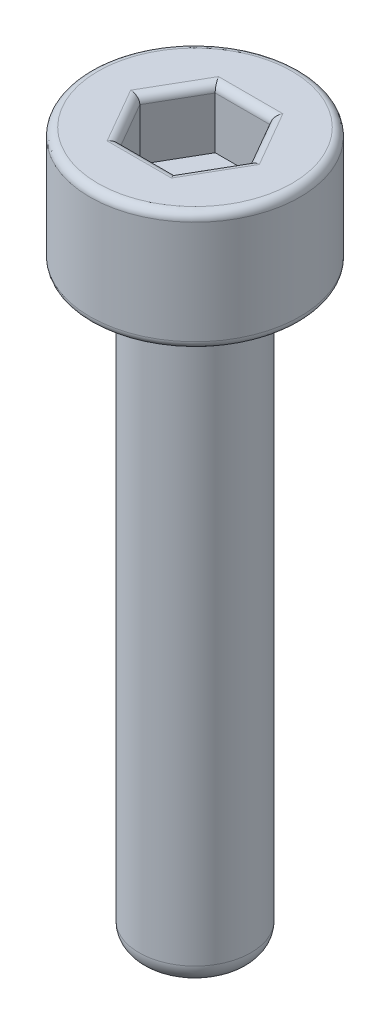
ISO-10303-21;
HEADER;
FILE_DESCRIPTION(('STEP AP214'),'2;1');
FILE_NAME('part.step','',(''),(''),'','','');
FILE_SCHEMA(('AUTOMOTIVE_DESIGN { 1 0 10303 214 1 1 1 1 }'));
ENDSEC;
DATA;
#1=APPLICATION_CONTEXT('core data for automotive mechanical design processes');
#2=APPLICATION_PROTOCOL_DEFINITION('international standard','automotive_design',2000,#1);
#3=PRODUCT_CONTEXT('',#1,'mechanical');
#4=PRODUCT('Part','Part','',(#3));
#5=PRODUCT_RELATED_PRODUCT_CATEGORY('part','',(#4));
#6=PRODUCT_DEFINITION_FORMATION('','',#4);
#7=PRODUCT_DEFINITION_CONTEXT('part definition',#1,'design');
#8=PRODUCT_DEFINITION('design','',#6,#7);
#9=PRODUCT_DEFINITION_SHAPE('','',#8);
#10=(LENGTH_UNIT() NAMED_UNIT(*) SI_UNIT(.MILLI.,.METRE.));
#11=(NAMED_UNIT(*) PLANE_ANGLE_UNIT() SI_UNIT($,.RADIAN.));
#12=(NAMED_UNIT(*) SI_UNIT($,.STERADIAN.) SOLID_ANGLE_UNIT());
#13=UNCERTAINTY_MEASURE_WITH_UNIT(LENGTH_MEASURE(1.E-05),#10,'distance_accuracy_value','');
#14=(GEOMETRIC_REPRESENTATION_CONTEXT(3) GLOBAL_UNCERTAINTY_ASSIGNED_CONTEXT((#13)) GLOBAL_UNIT_ASSIGNED_CONTEXT((#10,
#11,#12)) REPRESENTATION_CONTEXT('',''));
#15=CARTESIAN_POINT('',(0.,0.,0.));
#16=DIRECTION('',(0.,0.,1.));
#17=DIRECTION('',(1.,0.,0.));
#18=AXIS2_PLACEMENT_3D('',#15,#16,#17);
#19=CARTESIAN_POINT('',(0.,3.,0.));
#20=DIRECTION('',(0.,-1.,0.));
#21=DIRECTION('',(0.,0.,-1.));
#22=AXIS2_PLACEMENT_3D('',#19,#20,#21);
#23=CYLINDRICAL_SURFACE('',#22,2.64);
#24=CARTESIAN_POINT('',(0.,2.8,0.));
#25=DIRECTION('',(0.,1.,0.));
#26=DIRECTION('',(0.,0.,1.));
#27=AXIS2_PLACEMENT_3D('',#24,#25,#26);
#28=CIRCLE('',#27,2.64);
#29=CARTESIAN_POINT('',(0.,2.8,2.64));
#30=VERTEX_POINT('',#29);
#31=EDGE_CURVE('E186',#30,#30,#28,.F.);
#32=ORIENTED_EDGE('',*,*,#31,.T.);
#33=EDGE_LOOP('',(#32));
#34=FACE_BOUND('',#33,.T.);
#35=CARTESIAN_POINT('',(0.,0.2,0.));
#36=DIRECTION('',(0.,1.,0.));
#37=DIRECTION('',(0.,0.,1.));
#38=AXIS2_PLACEMENT_3D('',#35,#36,#37);
#39=CIRCLE('',#38,2.64);
#40=CARTESIAN_POINT('',(0.,0.2,2.64));
#41=VERTEX_POINT('',#40);
#42=EDGE_CURVE('E182',#41,#41,#39,.T.);
#43=ORIENTED_EDGE('',*,*,#42,.T.);
#44=EDGE_LOOP('',(#43));
#45=FACE_BOUND('',#44,.T.);
#46=ADVANCED_FACE('F39',(#34,#45),#23,.T.);
#47=CARTESIAN_POINT('',(0.,3.,0.));
#48=DIRECTION('',(0.,1.,0.));
#49=DIRECTION('',(0.,0.,1.));
#50=AXIS2_PLACEMENT_3D('',#47,#48,#49);
#51=PLANE('',#50);
#52=DIRECTION('',(-1.,0.,0.));
#53=VECTOR('',#52,1.);
#54=CARTESIAN_POINT('',(0.692820323027551,3.,-1.4));
#55=LINE('',#54,#53);
#56=CARTESIAN_POINT('',(-0.808290376865475,3.,-1.4));
#57=VERTEX_POINT('',#56);
#58=CARTESIAN_POINT('',(0.808290376865476,3.,-1.4));
#59=VERTEX_POINT('',#58);
#60=EDGE_CURVE('E209',#57,#59,#55,.F.);
#61=ORIENTED_EDGE('',*,*,#60,.T.);
#62=DIRECTION('',(-0.5,0.,-0.866025403784439));
#63=VECTOR('',#62,1.);
#64=CARTESIAN_POINT('',(1.55884572681199,3.,-0.0999999999999999));
#65=LINE('',#64,#63);
#66=CARTESIAN_POINT('',(1.61658075373095,3.,0.));
#67=VERTEX_POINT('',#66);
#68=EDGE_CURVE('E212',#59,#67,#65,.F.);
#69=ORIENTED_EDGE('',*,*,#68,.T.);
#70=DIRECTION('',(0.5,0.,-0.866025403784439));
#71=VECTOR('',#70,1.);
#72=CARTESIAN_POINT('',(0.866025403784438,3.,1.3));
#73=LINE('',#72,#71);
#74=CARTESIAN_POINT('',(0.808290376865476,3.,1.4));
#75=VERTEX_POINT('',#74);
#76=EDGE_CURVE('E197',#67,#75,#73,.F.);
#77=ORIENTED_EDGE('',*,*,#76,.T.);
#78=DIRECTION('',(1.,0.,0.));
#79=VECTOR('',#78,1.);
#80=CARTESIAN_POINT('',(-0.692820323027551,3.,1.4));
#81=LINE('',#80,#79);
#82=CARTESIAN_POINT('',(-0.808290376865476,3.,1.4));
#83=VERTEX_POINT('',#82);
#84=EDGE_CURVE('E200',#75,#83,#81,.F.);
#85=ORIENTED_EDGE('',*,*,#84,.T.);
#86=DIRECTION('',(0.5,0.,0.866025403784439));
#87=VECTOR('',#86,1.);
#88=CARTESIAN_POINT('',(-1.55884572681199,3.,0.1));
#89=LINE('',#88,#87);
#90=CARTESIAN_POINT('',(-1.61658075373095,3.,0.));
#91=VERTEX_POINT('',#90);
#92=EDGE_CURVE('E203',#83,#91,#89,.F.);
#93=ORIENTED_EDGE('',*,*,#92,.T.);
#94=DIRECTION('',(-0.5,0.,0.866025403784439));
#95=VECTOR('',#94,1.);
#96=CARTESIAN_POINT('',(-0.866025403784438,3.,-1.3));
#97=LINE('',#96,#95);
#98=EDGE_CURVE('E206',#91,#57,#97,.F.);
#99=ORIENTED_EDGE('',*,*,#98,.T.);
#100=EDGE_LOOP('',(#61,#69,#77,#85,#93,#99));
#101=FACE_BOUND('',#100,.T.);
#102=CARTESIAN_POINT('',(0.,3.,0.));
#103=DIRECTION('',(0.,1.,0.));
#104=DIRECTION('',(0.,0.,1.));
#105=AXIS2_PLACEMENT_3D('',#102,#103,#104);
#106=CIRCLE('',#105,2.44);
#107=CARTESIAN_POINT('',(0.,3.,2.44));
#108=VERTEX_POINT('',#107);
#109=EDGE_CURVE('E178',#108,#108,#106,.T.);
#110=ORIENTED_EDGE('',*,*,#109,.T.);
#111=EDGE_LOOP('',(#110));
#112=FACE_BOUND('',#111,.T.);
#113=ADVANCED_FACE('F261',(#101,#112),#51,.T.);
#114=CARTESIAN_POINT('',(0.,0.,0.));
#115=DIRECTION('',(0.,1.,0.));
#116=DIRECTION('',(0.,0.,1.));
#117=AXIS2_PLACEMENT_3D('',#114,#115,#116);
#118=PLANE('',#117);
#119=CARTESIAN_POINT('',(0.,0.,0.));
#120=DIRECTION('',(0.,1.,0.));
#121=DIRECTION('',(0.,0.,1.));
#122=AXIS2_PLACEMENT_3D('',#119,#120,#121);
#123=CIRCLE('',#122,2.44);
#124=CARTESIAN_POINT('',(0.,0.,2.44));
#125=VERTEX_POINT('',#124);
#126=EDGE_CURVE('E190',#125,#125,#123,.F.);
#127=ORIENTED_EDGE('',*,*,#126,.T.);
#128=EDGE_LOOP('',(#127));
#129=FACE_BOUND('',#128,.T.);
#130=CARTESIAN_POINT('',(0.,0.,0.));
#131=DIRECTION('',(0.,-1.,0.));
#132=DIRECTION('',(0.,0.,-1.));
#133=AXIS2_PLACEMENT_3D('',#130,#131,#132);
#134=CIRCLE('',#133,1.405);
#135=CARTESIAN_POINT('',(0.,0.,-1.405));
#136=VERTEX_POINT('',#135);
#137=EDGE_CURVE('E162',#136,#136,#134,.T.);
#138=ORIENTED_EDGE('',*,*,#137,.F.);
#139=EDGE_LOOP('',(#138));
#140=FACE_BOUND('',#139,.T.);
#141=ADVANCED_FACE('F267',(#129,#140),#118,.F.);
#142=CARTESIAN_POINT('',(0.,-14.76,0.));
#143=DIRECTION('',(0.,1.,0.));
#144=DIRECTION('',(0.,0.,1.));
#145=AXIS2_PLACEMENT_3D('',#142,#143,#144);
#146=CYLINDRICAL_SURFACE('',#145,1.405);
#147=CARTESIAN_POINT('',(0.,-14.26,0.));
#148=DIRECTION('',(0.,-1.,0.));
#149=DIRECTION('',(0.,0.,-1.));
#150=AXIS2_PLACEMENT_3D('',#147,#148,#149);
#151=CIRCLE('',#150,1.405);
#152=CARTESIAN_POINT('',(0.,-14.26,-1.405));
#153=VERTEX_POINT('',#152);
#154=EDGE_CURVE('E11',#153,#153,#151,.F.);
#155=ORIENTED_EDGE('',*,*,#154,.T.);
#156=EDGE_LOOP('',(#155));
#157=FACE_BOUND('',#156,.T.);
#158=ORIENTED_EDGE('',*,*,#137,.T.);
#159=EDGE_LOOP('',(#158));
#160=FACE_BOUND('',#159,.T.);
#161=ADVANCED_FACE('F342',(#157,#160),#146,.T.);
#162=CARTESIAN_POINT('',(0.,-14.76,0.));
#163=DIRECTION('',(0.,-1.,0.));
#164=DIRECTION('',(0.,0.,-1.));
#165=AXIS2_PLACEMENT_3D('',#162,#163,#164);
#166=PLANE('',#165);
#167=CARTESIAN_POINT('',(0.,-14.76,0.));
#168=DIRECTION('',(0.,-1.,0.));
#169=DIRECTION('',(0.,0.,-1.));
#170=AXIS2_PLACEMENT_3D('',#167,#168,#169);
#171=CIRCLE('',#170,0.905);
#172=CARTESIAN_POINT('',(0.,-14.76,-0.905));
#173=VERTEX_POINT('',#172);
#174=EDGE_CURVE('E48',#173,#173,#171,.T.);
#175=ORIENTED_EDGE('',*,*,#174,.T.);
#176=EDGE_LOOP('',(#175));
#177=FACE_BOUND('',#176,.T.);
#178=ADVANCED_FACE('F248',(#177),#166,.T.);
#179=CARTESIAN_POINT('',(0.,2.8,0.));
#180=DIRECTION('',(0.,1.,0.));
#181=DIRECTION('',(0.,0.,1.));
#182=AXIS2_PLACEMENT_3D('',#179,#180,#181);
#183=TOROIDAL_SURFACE('',#182,2.44,0.2);
#184=ORIENTED_EDGE('',*,*,#31,.F.);
#185=EDGE_LOOP('',(#184));
#186=FACE_BOUND('',#185,.T.);
#187=ORIENTED_EDGE('',*,*,#109,.F.);
#188=EDGE_LOOP('',(#187));
#189=FACE_BOUND('',#188,.T.);
#190=ADVANCED_FACE('F273',(#186,#189),#183,.T.);
#191=CARTESIAN_POINT('',(0.,0.2,0.));
#192=DIRECTION('',(0.,1.,0.));
#193=DIRECTION('',(0.,0.,1.));
#194=AXIS2_PLACEMENT_3D('',#191,#192,#193);
#195=TOROIDAL_SURFACE('',#194,2.44,0.2);
#196=ORIENTED_EDGE('',*,*,#126,.F.);
#197=EDGE_LOOP('',(#196));
#198=FACE_BOUND('',#197,.T.);
#199=ORIENTED_EDGE('',*,*,#42,.F.);
#200=EDGE_LOOP('',(#199));
#201=FACE_BOUND('',#200,.T.);
#202=ADVANCED_FACE('F276',(#198,#201),#195,.T.);
#203=CARTESIAN_POINT('',(0.692820323027551,1.5,1.2));
#204=DIRECTION('',(0.866025403784439,0.,0.5));
#205=DIRECTION('',(0.5,0.,-0.866025403784439));
#206=AXIS2_PLACEMENT_3D('',#203,#204,#205);
#207=PLANE('',#206);
#208=DIRECTION('',(0.,1.,0.));
#209=VECTOR('',#208,1.);
#210=CARTESIAN_POINT('',(0.692820323027551,1.5,1.2));
#211=LINE('',#210,#209);
#212=CARTESIAN_POINT('',(0.692820323027551,1.5,1.2));
#213=VERTEX_POINT('',#212);
#214=CARTESIAN_POINT('',(0.692820323027551,2.8,1.2));
#215=VERTEX_POINT('',#214);
#216=EDGE_CURVE('E159',#213,#215,#211,.T.);
#217=ORIENTED_EDGE('',*,*,#216,.T.);
#218=DIRECTION('',(0.5,0.,-0.866025403784439));
#219=VECTOR('',#218,1.);
#220=CARTESIAN_POINT('',(1.3856406460551,2.8,0.));
#221=LINE('',#220,#219);
#222=CARTESIAN_POINT('',(1.3856406460551,2.8,0.));
#223=VERTEX_POINT('',#222);
#224=EDGE_CURVE('E119',#215,#223,#221,.T.);
#225=ORIENTED_EDGE('',*,*,#224,.T.);
#226=DIRECTION('',(0.,1.,0.));
#227=VECTOR('',#226,1.);
#228=CARTESIAN_POINT('',(1.3856406460551,1.5,0.));
#229=LINE('',#228,#227);
#230=CARTESIAN_POINT('',(1.3856406460551,1.5,0.));
#231=VERTEX_POINT('',#230);
#232=EDGE_CURVE('E112',#231,#223,#229,.T.);
#233=ORIENTED_EDGE('',*,*,#232,.F.);
#234=DIRECTION('',(0.5,0.,-0.866025403784439));
#235=VECTOR('',#234,1.);
#236=CARTESIAN_POINT('',(0.692820323027551,1.5,1.2));
#237=LINE('',#236,#235);
#238=EDGE_CURVE('E116',#213,#231,#237,.T.);
#239=ORIENTED_EDGE('',*,*,#238,.F.);
#240=EDGE_LOOP('',(#217,#225,#233,#239));
#241=FACE_BOUND('',#240,.T.);
#242=ADVANCED_FACE('F114',(#241),#207,.F.);
#243=CARTESIAN_POINT('',(-0.692820323027551,1.5,1.2));
#244=DIRECTION('',(0.,0.,1.));
#245=DIRECTION('',(1.,0.,0.));
#246=AXIS2_PLACEMENT_3D('',#243,#244,#245);
#247=PLANE('',#246);
#248=DIRECTION('',(0.,1.,0.));
#249=VECTOR('',#248,1.);
#250=CARTESIAN_POINT('',(-0.692820323027551,1.5,1.2));
#251=LINE('',#250,#249);
#252=CARTESIAN_POINT('',(-0.692820323027551,1.5,1.2));
#253=VERTEX_POINT('',#252);
#254=CARTESIAN_POINT('',(-0.692820323027551,2.8,1.2));
#255=VERTEX_POINT('',#254);
#256=EDGE_CURVE('E163',#253,#255,#251,.T.);
#257=ORIENTED_EDGE('',*,*,#256,.T.);
#258=DIRECTION('',(1.,0.,0.));
#259=VECTOR('',#258,1.);
#260=CARTESIAN_POINT('',(0.692820323027551,2.8,1.2));
#261=LINE('',#260,#259);
#262=EDGE_CURVE('E55',#255,#215,#261,.T.);
#263=ORIENTED_EDGE('',*,*,#262,.T.);
#264=ORIENTED_EDGE('',*,*,#216,.F.);
#265=DIRECTION('',(1.,0.,0.));
#266=VECTOR('',#265,1.);
#267=CARTESIAN_POINT('',(-0.692820323027551,1.5,1.2));
#268=LINE('',#267,#266);
#269=EDGE_CURVE('E125',#253,#213,#268,.T.);
#270=ORIENTED_EDGE('',*,*,#269,.F.);
#271=EDGE_LOOP('',(#257,#263,#264,#270));
#272=FACE_BOUND('',#271,.T.);
#273=ADVANCED_FACE('F324',(#272),#247,.F.);
#274=CARTESIAN_POINT('',(-1.3856406460551,1.5,0.));
#275=DIRECTION('',(-0.866025403784439,0.,0.5));
#276=DIRECTION('',(0.5,0.,0.866025403784439));
#277=AXIS2_PLACEMENT_3D('',#274,#275,#276);
#278=PLANE('',#277);
#279=DIRECTION('',(0.,1.,0.));
#280=VECTOR('',#279,1.);
#281=CARTESIAN_POINT('',(-1.3856406460551,1.5,0.));
#282=LINE('',#281,#280);
#283=CARTESIAN_POINT('',(-1.3856406460551,1.5,0.));
#284=VERTEX_POINT('',#283);
#285=CARTESIAN_POINT('',(-1.3856406460551,2.8,0.));
#286=VERTEX_POINT('',#285);
#287=EDGE_CURVE('E166',#284,#286,#282,.T.);
#288=ORIENTED_EDGE('',*,*,#287,.T.);
#289=DIRECTION('',(0.5,0.,0.866025403784439));
#290=VECTOR('',#289,1.);
#291=CARTESIAN_POINT('',(-0.692820323027551,2.8,1.2));
#292=LINE('',#291,#290);
#293=EDGE_CURVE('E63',#286,#255,#292,.T.);
#294=ORIENTED_EDGE('',*,*,#293,.T.);
#295=ORIENTED_EDGE('',*,*,#256,.F.);
#296=DIRECTION('',(0.5,0.,0.866025403784439));
#297=VECTOR('',#296,1.);
#298=CARTESIAN_POINT('',(-1.3856406460551,1.5,0.));
#299=LINE('',#298,#297);
#300=EDGE_CURVE('E154',#284,#253,#299,.T.);
#301=ORIENTED_EDGE('',*,*,#300,.F.);
#302=EDGE_LOOP('',(#288,#294,#295,#301));
#303=FACE_BOUND('',#302,.T.);
#304=ADVANCED_FACE('F323',(#303),#278,.F.);
#305=CARTESIAN_POINT('',(-0.69282032302755,1.5,-1.2));
#306=DIRECTION('',(-0.866025403784439,0.,-0.5));
#307=DIRECTION('',(-0.5,0.,0.866025403784439));
#308=AXIS2_PLACEMENT_3D('',#305,#306,#307);
#309=PLANE('',#308);
#310=DIRECTION('',(0.,1.,0.));
#311=VECTOR('',#310,1.);
#312=CARTESIAN_POINT('',(-0.69282032302755,1.5,-1.2));
#313=LINE('',#312,#311);
#314=CARTESIAN_POINT('',(-0.69282032302755,1.5,-1.2));
#315=VERTEX_POINT('',#314);
#316=CARTESIAN_POINT('',(-0.69282032302755,2.8,-1.2));
#317=VERTEX_POINT('',#316);
#318=EDGE_CURVE('E169',#315,#317,#313,.T.);
#319=ORIENTED_EDGE('',*,*,#318,.T.);
#320=DIRECTION('',(-0.5,0.,0.866025403784439));
#321=VECTOR('',#320,1.);
#322=CARTESIAN_POINT('',(-1.3856406460551,2.8,0.));
#323=LINE('',#322,#321);
#324=EDGE_CURVE('E219',#317,#286,#323,.T.);
#325=ORIENTED_EDGE('',*,*,#324,.T.);
#326=ORIENTED_EDGE('',*,*,#287,.F.);
#327=DIRECTION('',(-0.5,0.,0.866025403784439));
#328=VECTOR('',#327,1.);
#329=CARTESIAN_POINT('',(-0.69282032302755,1.5,-1.2));
#330=LINE('',#329,#328);
#331=EDGE_CURVE('E150',#315,#284,#330,.T.);
#332=ORIENTED_EDGE('',*,*,#331,.F.);
#333=EDGE_LOOP('',(#319,#325,#326,#332));
#334=FACE_BOUND('',#333,.T.);
#335=ADVANCED_FACE('F322',(#334),#309,.F.);
#336=CARTESIAN_POINT('',(0.692820323027551,1.5,-1.2));
#337=DIRECTION('',(0.,0.,-1.));
#338=DIRECTION('',(-1.,0.,0.));
#339=AXIS2_PLACEMENT_3D('',#336,#337,#338);
#340=PLANE('',#339);
#341=DIRECTION('',(0.,1.,0.));
#342=VECTOR('',#341,1.);
#343=CARTESIAN_POINT('',(0.692820323027551,1.5,-1.2));
#344=LINE('',#343,#342);
#345=CARTESIAN_POINT('',(0.692820323027551,1.5,-1.2));
#346=VERTEX_POINT('',#345);
#347=CARTESIAN_POINT('',(0.692820323027551,2.8,-1.2));
#348=VERTEX_POINT('',#347);
#349=EDGE_CURVE('E124',#346,#348,#344,.T.);
#350=ORIENTED_EDGE('',*,*,#349,.T.);
#351=DIRECTION('',(-1.,0.,0.));
#352=VECTOR('',#351,1.);
#353=CARTESIAN_POINT('',(-0.69282032302755,2.8,-1.2));
#354=LINE('',#353,#352);
#355=EDGE_CURVE('E216',#348,#317,#354,.T.);
#356=ORIENTED_EDGE('',*,*,#355,.T.);
#357=ORIENTED_EDGE('',*,*,#318,.F.);
#358=DIRECTION('',(-1.,0.,0.));
#359=VECTOR('',#358,1.);
#360=CARTESIAN_POINT('',(0.692820323027551,1.5,-1.2));
#361=LINE('',#360,#359);
#362=EDGE_CURVE('E135',#346,#315,#361,.T.);
#363=ORIENTED_EDGE('',*,*,#362,.F.);
#364=EDGE_LOOP('',(#350,#356,#357,#363));
#365=FACE_BOUND('',#364,.T.);
#366=ADVANCED_FACE('F318',(#365),#340,.F.);
#367=CARTESIAN_POINT('',(1.3856406460551,1.5,0.));
#368=DIRECTION('',(0.866025403784439,0.,-0.5));
#369=DIRECTION('',(-0.5,0.,-0.866025403784439));
#370=AXIS2_PLACEMENT_3D('',#367,#368,#369);
#371=PLANE('',#370);
#372=ORIENTED_EDGE('',*,*,#232,.T.);
#373=DIRECTION('',(-0.5,0.,-0.866025403784439));
#374=VECTOR('',#373,1.);
#375=CARTESIAN_POINT('',(0.692820323027551,2.8,-1.2));
#376=LINE('',#375,#374);
#377=EDGE_CURVE('E194',#223,#348,#376,.T.);
#378=ORIENTED_EDGE('',*,*,#377,.T.);
#379=ORIENTED_EDGE('',*,*,#349,.F.);
#380=DIRECTION('',(-0.5,0.,-0.866025403784439));
#381=VECTOR('',#380,1.);
#382=CARTESIAN_POINT('',(1.3856406460551,1.5,0.));
#383=LINE('',#382,#381);
#384=EDGE_CURVE('E128',#231,#346,#383,.T.);
#385=ORIENTED_EDGE('',*,*,#384,.F.);
#386=EDGE_LOOP('',(#372,#378,#379,#385));
#387=FACE_BOUND('',#386,.T.);
#388=ADVANCED_FACE('F129',(#387),#371,.F.);
#389=CARTESIAN_POINT('',(0.,1.5,0.));
#390=DIRECTION('',(0.,1.,0.));
#391=DIRECTION('',(0.,0.,1.));
#392=AXIS2_PLACEMENT_3D('',#389,#390,#391);
#393=PLANE('',#392);
#394=ORIENTED_EDGE('',*,*,#238,.T.);
#395=ORIENTED_EDGE('',*,*,#384,.T.);
#396=ORIENTED_EDGE('',*,*,#362,.T.);
#397=ORIENTED_EDGE('',*,*,#331,.T.);
#398=ORIENTED_EDGE('',*,*,#300,.T.);
#399=ORIENTED_EDGE('',*,*,#269,.T.);
#400=EDGE_LOOP('',(#394,#395,#396,#397,#398,#399));
#401=FACE_BOUND('',#400,.T.);
#402=ADVANCED_FACE('F137',(#401),#393,.T.);
#403=CARTESIAN_POINT('',(-1.55884572681199,2.8,0.1));
#404=DIRECTION('',(-0.5,0.,-0.866025403784439));
#405=DIRECTION('',(-0.866025403784439,0.,0.5));
#406=AXIS2_PLACEMENT_3D('',#403,#404,#405);
#407=CYLINDRICAL_SURFACE('',#406,0.2);
#408=CARTESIAN_POINT('',(-1.61658075373095,2.8,0.));
#409=DIRECTION('',(0.,0.,-1.));
#410=DIRECTION('',(1.,0.,0.));
#411=AXIS2_PLACEMENT_3D('',#408,#409,#410);
#412=ELLIPSE('',#411,0.23094010767585,0.2);
#413=EDGE_CURVE('E145',#91,#286,#412,.T.);
#414=ORIENTED_EDGE('',*,*,#413,.F.);
#415=ORIENTED_EDGE('',*,*,#92,.F.);
#416=CARTESIAN_POINT('',(-0.808290376865476,2.8,1.4));
#417=DIRECTION('',(-0.866025403784438,0.,-0.5));
#418=DIRECTION('',(0.5,0.,-0.866025403784439));
#419=AXIS2_PLACEMENT_3D('',#416,#417,#418);
#420=ELLIPSE('',#419,0.23094010767585,0.2);
#421=EDGE_CURVE('E141',#255,#83,#420,.F.);
#422=ORIENTED_EDGE('',*,*,#421,.F.);
#423=ORIENTED_EDGE('',*,*,#293,.F.);
#424=EDGE_LOOP('',(#414,#415,#422,#423));
#425=FACE_BOUND('',#424,.T.);
#426=ADVANCED_FACE('F294',(#425),#407,.T.);
#427=CARTESIAN_POINT('',(-0.692820323027551,2.8,1.4));
#428=DIRECTION('',(-1.,0.,0.));
#429=DIRECTION('',(0.,0.,1.));
#430=AXIS2_PLACEMENT_3D('',#427,#428,#429);
#431=CYLINDRICAL_SURFACE('',#430,0.2);
#432=ORIENTED_EDGE('',*,*,#421,.T.);
#433=ORIENTED_EDGE('',*,*,#84,.F.);
#434=CARTESIAN_POINT('',(0.808290376865476,2.8,1.4));
#435=DIRECTION('',(-0.866025403784439,0.,0.5));
#436=DIRECTION('',(-0.5,0.,-0.866025403784439));
#437=AXIS2_PLACEMENT_3D('',#434,#435,#436);
#438=ELLIPSE('',#437,0.23094010767585,0.2);
#439=EDGE_CURVE('E238',#215,#75,#438,.F.);
#440=ORIENTED_EDGE('',*,*,#439,.F.);
#441=ORIENTED_EDGE('',*,*,#262,.F.);
#442=EDGE_LOOP('',(#432,#433,#440,#441));
#443=FACE_BOUND('',#442,.T.);
#444=ADVANCED_FACE('F291',(#443),#431,.T.);
#445=CARTESIAN_POINT('',(-0.866025403784438,2.8,-1.3));
#446=DIRECTION('',(0.5,0.,-0.866025403784439));
#447=DIRECTION('',(-0.866025403784439,0.,-0.5));
#448=AXIS2_PLACEMENT_3D('',#445,#446,#447);
#449=CYLINDRICAL_SURFACE('',#448,0.2);
#450=ORIENTED_EDGE('',*,*,#413,.T.);
#451=ORIENTED_EDGE('',*,*,#324,.F.);
#452=CARTESIAN_POINT('',(-0.808290376865475,2.8,-1.4));
#453=DIRECTION('',(0.866025403784439,0.,-0.5));
#454=DIRECTION('',(0.5,0.,0.866025403784439));
#455=AXIS2_PLACEMENT_3D('',#452,#453,#454);
#456=ELLIPSE('',#455,0.23094010767585,0.2);
#457=EDGE_CURVE('E234',#57,#317,#456,.T.);
#458=ORIENTED_EDGE('',*,*,#457,.F.);
#459=ORIENTED_EDGE('',*,*,#98,.F.);
#460=EDGE_LOOP('',(#450,#451,#458,#459));
#461=FACE_BOUND('',#460,.T.);
#462=ADVANCED_FACE('F287',(#461),#449,.T.);
#463=CARTESIAN_POINT('',(0.866025403784438,2.8,1.3));
#464=DIRECTION('',(-0.5,0.,0.866025403784439));
#465=DIRECTION('',(0.866025403784439,0.,0.5));
#466=AXIS2_PLACEMENT_3D('',#463,#464,#465);
#467=CYLINDRICAL_SURFACE('',#466,0.2);
#468=ORIENTED_EDGE('',*,*,#439,.T.);
#469=ORIENTED_EDGE('',*,*,#76,.F.);
#470=CARTESIAN_POINT('',(1.61658075373095,2.8,0.));
#471=DIRECTION('',(0.,0.,1.));
#472=DIRECTION('',(1.,0.,0.));
#473=AXIS2_PLACEMENT_3D('',#470,#471,#472);
#474=ELLIPSE('',#473,0.23094010767585,0.2);
#475=EDGE_CURVE('E231',#223,#67,#474,.F.);
#476=ORIENTED_EDGE('',*,*,#475,.F.);
#477=ORIENTED_EDGE('',*,*,#224,.F.);
#478=EDGE_LOOP('',(#468,#469,#476,#477));
#479=FACE_BOUND('',#478,.T.);
#480=ADVANCED_FACE('F283',(#479),#467,.T.);
#481=CARTESIAN_POINT('',(0.692820323027551,2.8,-1.4));
#482=DIRECTION('',(1.,0.,0.));
#483=DIRECTION('',(0.,0.,-1.));
#484=AXIS2_PLACEMENT_3D('',#481,#482,#483);
#485=CYLINDRICAL_SURFACE('',#484,0.2);
#486=ORIENTED_EDGE('',*,*,#457,.T.);
#487=ORIENTED_EDGE('',*,*,#355,.F.);
#488=CARTESIAN_POINT('',(0.808290376865476,2.8,-1.4));
#489=DIRECTION('',(0.866025403784439,0.,0.5));
#490=DIRECTION('',(-0.5,0.,0.866025403784439));
#491=AXIS2_PLACEMENT_3D('',#488,#489,#490);
#492=ELLIPSE('',#491,0.23094010767585,0.2);
#493=EDGE_CURVE('E228',#59,#348,#492,.T.);
#494=ORIENTED_EDGE('',*,*,#493,.F.);
#495=ORIENTED_EDGE('',*,*,#60,.F.);
#496=EDGE_LOOP('',(#486,#487,#494,#495));
#497=FACE_BOUND('',#496,.T.);
#498=ADVANCED_FACE('F256',(#497),#485,.T.);
#499=CARTESIAN_POINT('',(1.55884572681199,2.8,-0.0999999999999997));
#500=DIRECTION('',(0.5,0.,0.866025403784439));
#501=DIRECTION('',(0.866025403784439,0.,-0.5));
#502=AXIS2_PLACEMENT_3D('',#499,#500,#501);
#503=CYLINDRICAL_SURFACE('',#502,0.2);
#504=ORIENTED_EDGE('',*,*,#475,.T.);
#505=ORIENTED_EDGE('',*,*,#68,.F.);
#506=ORIENTED_EDGE('',*,*,#493,.T.);
#507=ORIENTED_EDGE('',*,*,#377,.F.);
#508=EDGE_LOOP('',(#504,#505,#506,#507));
#509=FACE_BOUND('',#508,.T.);
#510=ADVANCED_FACE('F251',(#509),#503,.T.);
#511=CARTESIAN_POINT('',(0.,-14.26,0.));
#512=DIRECTION('',(0.,-1.,0.));
#513=DIRECTION('',(0.,0.,-1.));
#514=AXIS2_PLACEMENT_3D('',#511,#512,#513);
#515=TOROIDAL_SURFACE('',#514,0.905,0.5);
#516=ORIENTED_EDGE('',*,*,#154,.F.);
#517=EDGE_LOOP('',(#516));
#518=FACE_BOUND('',#517,.T.);
#519=ORIENTED_EDGE('',*,*,#174,.F.);
#520=EDGE_LOOP('',(#519));
#521=FACE_BOUND('',#520,.T.);
#522=ADVANCED_FACE('F41',(#518,#521),#515,.T.);
#523=CLOSED_SHELL('',(#46,#113,#141,#161,#178,#190,#202,#242,#273,#304,#335,#366,#388,#402,#426,
#444,#462,#480,#498,#510,#522));
#524=MANIFOLD_SOLID_BREP('B2',#523);
#525=ADVANCED_BREP_SHAPE_REPRESENTATION('',(#18,#524),#14);
#526=SHAPE_DEFINITION_REPRESENTATION(#9,#525);
ENDSEC;
END-ISO-10303-21;
